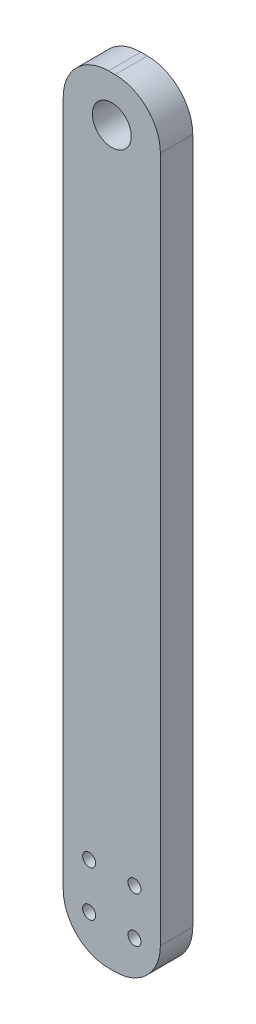
ISO-10303-21;
HEADER;
FILE_DESCRIPTION(('STEP AP214'),'2;1');
FILE_NAME('part.step','',(''),(''),'','','');
FILE_SCHEMA(('AUTOMOTIVE_DESIGN { 1 0 10303 214 1 1 1 1 }'));
ENDSEC;
DATA;
#1=APPLICATION_CONTEXT('core data for automotive mechanical design processes');
#2=APPLICATION_PROTOCOL_DEFINITION('international standard','automotive_design',2000,#1);
#3=PRODUCT_CONTEXT('',#1,'mechanical');
#4=PRODUCT('Part','Part','',(#3));
#5=PRODUCT_RELATED_PRODUCT_CATEGORY('part','',(#4));
#6=PRODUCT_DEFINITION_FORMATION('','',#4);
#7=PRODUCT_DEFINITION_CONTEXT('part definition',#1,'design');
#8=PRODUCT_DEFINITION('design','',#6,#7);
#9=PRODUCT_DEFINITION_SHAPE('','',#8);
#10=(LENGTH_UNIT() NAMED_UNIT(*) SI_UNIT(.MILLI.,.METRE.));
#11=(NAMED_UNIT(*) PLANE_ANGLE_UNIT() SI_UNIT($,.RADIAN.));
#12=(NAMED_UNIT(*) SI_UNIT($,.STERADIAN.) SOLID_ANGLE_UNIT());
#13=UNCERTAINTY_MEASURE_WITH_UNIT(LENGTH_MEASURE(1.E-05),#10,'distance_accuracy_value','');
#14=(GEOMETRIC_REPRESENTATION_CONTEXT(3) GLOBAL_UNCERTAINTY_ASSIGNED_CONTEXT((#13)) GLOBAL_UNIT_ASSIGNED_CONTEXT((#10,
#11,#12)) REPRESENTATION_CONTEXT('',''));
#15=CARTESIAN_POINT('',(0.,0.,0.));
#16=DIRECTION('',(0.,0.,1.));
#17=DIRECTION('',(1.,0.,0.));
#18=AXIS2_PLACEMENT_3D('',#15,#16,#17);
#19=CARTESIAN_POINT('',(0.,0.,5.));
#20=DIRECTION('',(0.,0.,1.));
#21=DIRECTION('',(1.,0.,0.));
#22=AXIS2_PLACEMENT_3D('',#19,#20,#21);
#23=PLANE('',#22);
#24=CARTESIAN_POINT('',(1.,8.,5.));
#25=DIRECTION('',(0.,0.,1.));
#26=DIRECTION('',(1.,0.,0.));
#27=AXIS2_PLACEMENT_3D('',#24,#25,#26);
#28=CIRCLE('',#27,1.);
#29=CARTESIAN_POINT('',(2.,8.,5.));
#30=VERTEX_POINT('',#29);
#31=EDGE_CURVE('E242',#30,#30,#28,.T.);
#32=ORIENTED_EDGE('',*,*,#31,.T.);
#33=EDGE_LOOP('',(#32));
#34=FACE_BOUND('',#33,.T.);
#35=CARTESIAN_POINT('',(7.99999999999999,1.,5.));
#36=DIRECTION('',(0.,0.,1.));
#37=DIRECTION('',(1.,0.,0.));
#38=AXIS2_PLACEMENT_3D('',#35,#36,#37);
#39=CIRCLE('',#38,1.);
#40=CARTESIAN_POINT('',(8.99999999999999,1.,5.));
#41=VERTEX_POINT('',#40);
#42=EDGE_CURVE('E228',#41,#41,#39,.T.);
#43=ORIENTED_EDGE('',*,*,#42,.T.);
#44=EDGE_LOOP('',(#43));
#45=FACE_BOUND('',#44,.T.);
#46=CARTESIAN_POINT('',(4.49999999999999,108.,5.));
#47=DIRECTION('',(0.,0.,1.));
#48=DIRECTION('',(1.,0.,0.));
#49=AXIS2_PLACEMENT_3D('',#46,#47,#48);
#50=CIRCLE('',#49,3.);
#51=CARTESIAN_POINT('',(7.5,108.,5.));
#52=VERTEX_POINT('',#51);
#53=EDGE_CURVE('E130',#52,#52,#50,.T.);
#54=ORIENTED_EDGE('',*,*,#53,.T.);
#55=EDGE_LOOP('',(#54));
#56=FACE_BOUND('',#55,.T.);
#57=CARTESIAN_POINT('',(3.99999999999999,2.,5.));
#58=DIRECTION('',(0.,0.,1.));
#59=DIRECTION('',(1.,0.,0.));
#60=AXIS2_PLACEMENT_3D('',#57,#58,#59);
#61=CIRCLE('',#60,7.);
#62=CARTESIAN_POINT('',(4.00000000000004,-5.,5.));
#63=VERTEX_POINT('',#62);
#64=CARTESIAN_POINT('',(-3.00000000000001,2.00000000000005,5.));
#65=VERTEX_POINT('',#64);
#66=EDGE_CURVE('E133',#63,#65,#61,.F.);
#67=ORIENTED_EDGE('',*,*,#66,.T.);
#68=DIRECTION('',(0.,1.,0.));
#69=VECTOR('',#68,1.);
#70=CARTESIAN_POINT('',(-3.00000000000001,0.,5.));
#71=LINE('',#70,#69);
#72=CARTESIAN_POINT('',(-3.00000000000001,108.,5.));
#73=VERTEX_POINT('',#72);
#74=EDGE_CURVE('E151',#65,#73,#71,.T.);
#75=ORIENTED_EDGE('',*,*,#74,.T.);
#76=CARTESIAN_POINT('',(3.99999999999999,108.,5.));
#77=DIRECTION('',(0.,0.,1.));
#78=DIRECTION('',(1.,0.,0.));
#79=AXIS2_PLACEMENT_3D('',#76,#77,#78);
#80=CIRCLE('',#79,7.);
#81=CARTESIAN_POINT('',(3.99999999999999,115.,5.));
#82=VERTEX_POINT('',#81);
#83=EDGE_CURVE('E149',#82,#73,#80,.T.);
#84=ORIENTED_EDGE('',*,*,#83,.F.);
#85=DIRECTION('',(1.,0.,0.));
#86=VECTOR('',#85,1.);
#87=CARTESIAN_POINT('',(0.,115.,5.));
#88=LINE('',#87,#86);
#89=CARTESIAN_POINT('',(4.99999999999999,115.,5.));
#90=VERTEX_POINT('',#89);
#91=EDGE_CURVE('E108',#82,#90,#88,.T.);
#92=ORIENTED_EDGE('',*,*,#91,.T.);
#93=CARTESIAN_POINT('',(4.99999999999999,108.,5.));
#94=DIRECTION('',(0.,0.,1.));
#95=DIRECTION('',(1.,0.,0.));
#96=AXIS2_PLACEMENT_3D('',#93,#94,#95);
#97=CIRCLE('',#96,7.);
#98=CARTESIAN_POINT('',(12.,108.,5.));
#99=VERTEX_POINT('',#98);
#100=EDGE_CURVE('E145',#90,#99,#97,.F.);
#101=ORIENTED_EDGE('',*,*,#100,.T.);
#102=DIRECTION('',(0.,1.,0.));
#103=VECTOR('',#102,1.);
#104=CARTESIAN_POINT('',(12.,0.,5.));
#105=LINE('',#104,#103);
#106=CARTESIAN_POINT('',(12.,2.00000000000005,5.));
#107=VERTEX_POINT('',#106);
#108=EDGE_CURVE('E142',#107,#99,#105,.T.);
#109=ORIENTED_EDGE('',*,*,#108,.F.);
#110=CARTESIAN_POINT('',(4.99999999999999,2.,5.));
#111=DIRECTION('',(0.,0.,1.));
#112=DIRECTION('',(1.,0.,0.));
#113=AXIS2_PLACEMENT_3D('',#110,#111,#112);
#114=CIRCLE('',#113,7.);
#115=CARTESIAN_POINT('',(4.99999999999994,-5.,5.));
#116=VERTEX_POINT('',#115);
#117=EDGE_CURVE('E139',#116,#107,#114,.T.);
#118=ORIENTED_EDGE('',*,*,#117,.F.);
#119=DIRECTION('',(1.,0.,0.));
#120=VECTOR('',#119,1.);
#121=CARTESIAN_POINT('',(0.,-5.,5.));
#122=LINE('',#121,#120);
#123=EDGE_CURVE('E136',#63,#116,#122,.T.);
#124=ORIENTED_EDGE('',*,*,#123,.F.);
#125=EDGE_LOOP('',(#67,#75,#84,#92,#101,#109,#118,#124));
#126=FACE_BOUND('',#125,.T.);
#127=CARTESIAN_POINT('',(7.99999999999999,8.,5.));
#128=DIRECTION('',(0.,0.,1.));
#129=DIRECTION('',(1.,0.,0.));
#130=AXIS2_PLACEMENT_3D('',#127,#128,#129);
#131=CIRCLE('',#130,1.);
#132=CARTESIAN_POINT('',(9.,8.,5.));
#133=VERTEX_POINT('',#132);
#134=EDGE_CURVE('E134',#133,#133,#131,.T.);
#135=ORIENTED_EDGE('',*,*,#134,.T.);
#136=EDGE_LOOP('',(#135));
#137=FACE_BOUND('',#136,.T.);
#138=CARTESIAN_POINT('',(1.,1.,5.));
#139=DIRECTION('',(0.,0.,1.));
#140=DIRECTION('',(1.,0.,0.));
#141=AXIS2_PLACEMENT_3D('',#138,#139,#140);
#142=CIRCLE('',#141,1.);
#143=CARTESIAN_POINT('',(2.,1.,5.));
#144=VERTEX_POINT('',#143);
#145=EDGE_CURVE('E233',#144,#144,#142,.T.);
#146=ORIENTED_EDGE('',*,*,#145,.T.);
#147=EDGE_LOOP('',(#146));
#148=FACE_BOUND('',#147,.T.);
#149=ADVANCED_FACE('F34',(#34,#45,#56,#126,#137,#148),#23,.F.);
#150=CARTESIAN_POINT('',(3.99999999999999,2.,10.));
#151=DIRECTION('',(0.,0.,-1.));
#152=DIRECTION('',(-1.,0.,0.));
#153=AXIS2_PLACEMENT_3D('',#150,#151,#152);
#154=CYLINDRICAL_SURFACE('',#153,7.);
#155=ORIENTED_EDGE('',*,*,#66,.F.);
#156=DIRECTION('',(0.,0.,-1.));
#157=VECTOR('',#156,1.);
#158=CARTESIAN_POINT('',(4.00000000000004,-5.,10.));
#159=LINE('',#158,#157);
#160=CARTESIAN_POINT('',(4.00000000000004,-5.,10.));
#161=VERTEX_POINT('',#160);
#162=EDGE_CURVE('E11',#161,#63,#159,.T.);
#163=ORIENTED_EDGE('',*,*,#162,.F.);
#164=CARTESIAN_POINT('',(3.99999999999999,2.,10.));
#165=DIRECTION('',(0.,0.,1.));
#166=DIRECTION('',(1.,0.,0.));
#167=AXIS2_PLACEMENT_3D('',#164,#165,#166);
#168=CIRCLE('',#167,7.);
#169=CARTESIAN_POINT('',(-3.00000000000001,2.00000000000005,10.));
#170=VERTEX_POINT('',#169);
#171=EDGE_CURVE('E252',#161,#170,#168,.F.);
#172=ORIENTED_EDGE('',*,*,#171,.T.);
#173=DIRECTION('',(0.,0.,-1.));
#174=VECTOR('',#173,1.);
#175=CARTESIAN_POINT('',(-3.00000000000001,2.00000000000005,10.));
#176=LINE('',#175,#174);
#177=EDGE_CURVE('E51',#170,#65,#176,.T.);
#178=ORIENTED_EDGE('',*,*,#177,.T.);
#179=EDGE_LOOP('',(#155,#163,#172,#178));
#180=FACE_BOUND('',#179,.T.);
#181=ADVANCED_FACE('F175',(#180),#154,.T.);
#182=CARTESIAN_POINT('',(0.,-5.,10.));
#183=DIRECTION('',(0.,1.,0.));
#184=DIRECTION('',(0.,0.,1.));
#185=AXIS2_PLACEMENT_3D('',#182,#183,#184);
#186=PLANE('',#185);
#187=ORIENTED_EDGE('',*,*,#123,.T.);
#188=DIRECTION('',(0.,0.,-1.));
#189=VECTOR('',#188,1.);
#190=CARTESIAN_POINT('',(4.99999999999994,-5.,10.));
#191=LINE('',#190,#189);
#192=CARTESIAN_POINT('',(4.99999999999994,-5.,10.));
#193=VERTEX_POINT('',#192);
#194=EDGE_CURVE('E43',#193,#116,#191,.T.);
#195=ORIENTED_EDGE('',*,*,#194,.F.);
#196=DIRECTION('',(1.,0.,0.));
#197=VECTOR('',#196,1.);
#198=CARTESIAN_POINT('',(0.,-5.,10.));
#199=LINE('',#198,#197);
#200=EDGE_CURVE('E254',#161,#193,#199,.T.);
#201=ORIENTED_EDGE('',*,*,#200,.F.);
#202=ORIENTED_EDGE('',*,*,#162,.T.);
#203=EDGE_LOOP('',(#187,#195,#201,#202));
#204=FACE_BOUND('',#203,.T.);
#205=ADVANCED_FACE('F172',(#204),#186,.F.);
#206=CARTESIAN_POINT('',(4.99999999999999,2.,10.));
#207=DIRECTION('',(0.,0.,-1.));
#208=DIRECTION('',(-1.,0.,0.));
#209=AXIS2_PLACEMENT_3D('',#206,#207,#208);
#210=CYLINDRICAL_SURFACE('',#209,7.);
#211=ORIENTED_EDGE('',*,*,#117,.T.);
#212=DIRECTION('',(0.,0.,-1.));
#213=VECTOR('',#212,1.);
#214=CARTESIAN_POINT('',(12.,2.00000000000005,10.));
#215=LINE('',#214,#213);
#216=CARTESIAN_POINT('',(12.,2.00000000000005,10.));
#217=VERTEX_POINT('',#216);
#218=EDGE_CURVE('E160',#217,#107,#215,.T.);
#219=ORIENTED_EDGE('',*,*,#218,.F.);
#220=CARTESIAN_POINT('',(4.99999999999999,2.,10.));
#221=DIRECTION('',(0.,0.,1.));
#222=DIRECTION('',(1.,0.,0.));
#223=AXIS2_PLACEMENT_3D('',#220,#221,#222);
#224=CIRCLE('',#223,7.);
#225=EDGE_CURVE('E168',#193,#217,#224,.T.);
#226=ORIENTED_EDGE('',*,*,#225,.F.);
#227=ORIENTED_EDGE('',*,*,#194,.T.);
#228=EDGE_LOOP('',(#211,#219,#226,#227));
#229=FACE_BOUND('',#228,.T.);
#230=ADVANCED_FACE('F165',(#229),#210,.T.);
#231=CARTESIAN_POINT('',(12.,0.,10.));
#232=DIRECTION('',(-1.,0.,0.));
#233=DIRECTION('',(0.,0.,1.));
#234=AXIS2_PLACEMENT_3D('',#231,#232,#233);
#235=PLANE('',#234);
#236=ORIENTED_EDGE('',*,*,#108,.T.);
#237=DIRECTION('',(0.,0.,-1.));
#238=VECTOR('',#237,1.);
#239=CARTESIAN_POINT('',(12.,108.,10.));
#240=LINE('',#239,#238);
#241=CARTESIAN_POINT('',(12.,108.,10.));
#242=VERTEX_POINT('',#241);
#243=EDGE_CURVE('E158',#242,#99,#240,.T.);
#244=ORIENTED_EDGE('',*,*,#243,.F.);
#245=DIRECTION('',(0.,1.,0.));
#246=VECTOR('',#245,1.);
#247=CARTESIAN_POINT('',(12.,0.,10.));
#248=LINE('',#247,#246);
#249=EDGE_CURVE('E125',#217,#242,#248,.T.);
#250=ORIENTED_EDGE('',*,*,#249,.F.);
#251=ORIENTED_EDGE('',*,*,#218,.T.);
#252=EDGE_LOOP('',(#236,#244,#250,#251));
#253=FACE_BOUND('',#252,.T.);
#254=ADVANCED_FACE('F187',(#253),#235,.F.);
#255=CARTESIAN_POINT('',(4.99999999999999,108.,10.));
#256=DIRECTION('',(0.,0.,-1.));
#257=DIRECTION('',(-1.,0.,0.));
#258=AXIS2_PLACEMENT_3D('',#255,#256,#257);
#259=CYLINDRICAL_SURFACE('',#258,7.);
#260=ORIENTED_EDGE('',*,*,#100,.F.);
#261=DIRECTION('',(0.,0.,-1.));
#262=VECTOR('',#261,1.);
#263=CARTESIAN_POINT('',(4.99999999999999,115.,10.));
#264=LINE('',#263,#262);
#265=CARTESIAN_POINT('',(4.99999999999999,115.,10.));
#266=VERTEX_POINT('',#265);
#267=EDGE_CURVE('E111',#266,#90,#264,.T.);
#268=ORIENTED_EDGE('',*,*,#267,.F.);
#269=CARTESIAN_POINT('',(4.99999999999999,108.,10.));
#270=DIRECTION('',(0.,0.,1.));
#271=DIRECTION('',(1.,0.,0.));
#272=AXIS2_PLACEMENT_3D('',#269,#270,#271);
#273=CIRCLE('',#272,7.);
#274=EDGE_CURVE('E123',#266,#242,#273,.F.);
#275=ORIENTED_EDGE('',*,*,#274,.T.);
#276=ORIENTED_EDGE('',*,*,#243,.T.);
#277=EDGE_LOOP('',(#260,#268,#275,#276));
#278=FACE_BOUND('',#277,.T.);
#279=ADVANCED_FACE('F190',(#278),#259,.T.);
#280=CARTESIAN_POINT('',(0.,115.,10.));
#281=DIRECTION('',(0.,1.,0.));
#282=DIRECTION('',(0.,0.,1.));
#283=AXIS2_PLACEMENT_3D('',#280,#281,#282);
#284=PLANE('',#283);
#285=ORIENTED_EDGE('',*,*,#91,.F.);
#286=DIRECTION('',(0.,0.,-1.));
#287=VECTOR('',#286,1.);
#288=CARTESIAN_POINT('',(3.99999999999999,115.,10.));
#289=LINE('',#288,#287);
#290=CARTESIAN_POINT('',(3.99999999999999,115.,10.));
#291=VERTEX_POINT('',#290);
#292=EDGE_CURVE('E102',#291,#82,#289,.T.);
#293=ORIENTED_EDGE('',*,*,#292,.F.);
#294=DIRECTION('',(1.,0.,0.));
#295=VECTOR('',#294,1.);
#296=CARTESIAN_POINT('',(0.,115.,10.));
#297=LINE('',#296,#295);
#298=EDGE_CURVE('E106',#291,#266,#297,.T.);
#299=ORIENTED_EDGE('',*,*,#298,.T.);
#300=ORIENTED_EDGE('',*,*,#267,.T.);
#301=EDGE_LOOP('',(#285,#293,#299,#300));
#302=FACE_BOUND('',#301,.T.);
#303=ADVANCED_FACE('F104',(#302),#284,.T.);
#304=CARTESIAN_POINT('',(3.99999999999999,108.,10.));
#305=DIRECTION('',(0.,0.,-1.));
#306=DIRECTION('',(-1.,0.,0.));
#307=AXIS2_PLACEMENT_3D('',#304,#305,#306);
#308=CYLINDRICAL_SURFACE('',#307,7.);
#309=ORIENTED_EDGE('',*,*,#83,.T.);
#310=DIRECTION('',(0.,0.,-1.));
#311=VECTOR('',#310,1.);
#312=CARTESIAN_POINT('',(-3.00000000000001,108.,10.));
#313=LINE('',#312,#311);
#314=CARTESIAN_POINT('',(-3.00000000000001,108.,10.));
#315=VERTEX_POINT('',#314);
#316=EDGE_CURVE('E77',#315,#73,#313,.T.);
#317=ORIENTED_EDGE('',*,*,#316,.F.);
#318=CARTESIAN_POINT('',(3.99999999999999,108.,10.));
#319=DIRECTION('',(0.,0.,1.));
#320=DIRECTION('',(1.,0.,0.));
#321=AXIS2_PLACEMENT_3D('',#318,#319,#320);
#322=CIRCLE('',#321,7.);
#323=EDGE_CURVE('E113',#291,#315,#322,.T.);
#324=ORIENTED_EDGE('',*,*,#323,.F.);
#325=ORIENTED_EDGE('',*,*,#292,.T.);
#326=EDGE_LOOP('',(#309,#317,#324,#325));
#327=FACE_BOUND('',#326,.T.);
#328=ADVANCED_FACE('F114',(#327),#308,.T.);
#329=CARTESIAN_POINT('',(4.49999999999999,108.,10.));
#330=DIRECTION('',(0.,0.,-1.));
#331=DIRECTION('',(-1.,0.,0.));
#332=AXIS2_PLACEMENT_3D('',#329,#330,#331);
#333=CYLINDRICAL_SURFACE('',#332,3.);
#334=CARTESIAN_POINT('',(4.49999999999999,108.,10.));
#335=DIRECTION('',(0.,0.,1.));
#336=DIRECTION('',(1.,0.,0.));
#337=AXIS2_PLACEMENT_3D('',#334,#335,#336);
#338=CIRCLE('',#337,3.);
#339=CARTESIAN_POINT('',(7.5,108.,10.));
#340=VERTEX_POINT('',#339);
#341=EDGE_CURVE('E154',#340,#340,#338,.T.);
#342=ORIENTED_EDGE('',*,*,#341,.T.);
#343=EDGE_LOOP('',(#342));
#344=FACE_BOUND('',#343,.T.);
#345=ORIENTED_EDGE('',*,*,#53,.F.);
#346=EDGE_LOOP('',(#345));
#347=FACE_BOUND('',#346,.T.);
#348=ADVANCED_FACE('F36',(#344,#347),#333,.F.);
#349=CARTESIAN_POINT('',(-3.00000000000001,0.,10.));
#350=DIRECTION('',(-1.,0.,0.));
#351=DIRECTION('',(0.,0.,1.));
#352=AXIS2_PLACEMENT_3D('',#349,#350,#351);
#353=PLANE('',#352);
#354=ORIENTED_EDGE('',*,*,#74,.F.);
#355=ORIENTED_EDGE('',*,*,#177,.F.);
#356=DIRECTION('',(0.,1.,0.));
#357=VECTOR('',#356,1.);
#358=CARTESIAN_POINT('',(-3.00000000000001,0.,10.));
#359=LINE('',#358,#357);
#360=EDGE_CURVE('E117',#170,#315,#359,.T.);
#361=ORIENTED_EDGE('',*,*,#360,.T.);
#362=ORIENTED_EDGE('',*,*,#316,.T.);
#363=EDGE_LOOP('',(#354,#355,#361,#362));
#364=FACE_BOUND('',#363,.T.);
#365=ADVANCED_FACE('F199',(#364),#353,.T.);
#366=CARTESIAN_POINT('',(0.,0.,10.));
#367=DIRECTION('',(0.,0.,1.));
#368=DIRECTION('',(1.,0.,0.));
#369=AXIS2_PLACEMENT_3D('',#366,#367,#368);
#370=PLANE('',#369);
#371=CARTESIAN_POINT('',(7.99999999999999,1.,10.));
#372=DIRECTION('',(0.,0.,-1.));
#373=DIRECTION('',(-1.,0.,0.));
#374=AXIS2_PLACEMENT_3D('',#371,#372,#373);
#375=CIRCLE('',#374,1.);
#376=CARTESIAN_POINT('',(6.99999999999999,1.,10.));
#377=VERTEX_POINT('',#376);
#378=EDGE_CURVE('E225',#377,#377,#375,.T.);
#379=ORIENTED_EDGE('',*,*,#378,.T.);
#380=EDGE_LOOP('',(#379));
#381=FACE_BOUND('',#380,.T.);
#382=CARTESIAN_POINT('',(1.,1.,10.));
#383=DIRECTION('',(0.,0.,-1.));
#384=DIRECTION('',(-1.,0.,0.));
#385=AXIS2_PLACEMENT_3D('',#382,#383,#384);
#386=CIRCLE('',#385,1.);
#387=CARTESIAN_POINT('',(0.,1.,10.));
#388=VERTEX_POINT('',#387);
#389=EDGE_CURVE('E230',#388,#388,#386,.T.);
#390=ORIENTED_EDGE('',*,*,#389,.T.);
#391=EDGE_LOOP('',(#390));
#392=FACE_BOUND('',#391,.T.);
#393=CARTESIAN_POINT('',(1.,8.,10.));
#394=DIRECTION('',(0.,0.,-1.));
#395=DIRECTION('',(-1.,0.,0.));
#396=AXIS2_PLACEMENT_3D('',#393,#394,#395);
#397=CIRCLE('',#396,1.);
#398=CARTESIAN_POINT('',(0.,8.,10.));
#399=VERTEX_POINT('',#398);
#400=EDGE_CURVE('E239',#399,#399,#397,.T.);
#401=ORIENTED_EDGE('',*,*,#400,.T.);
#402=EDGE_LOOP('',(#401));
#403=FACE_BOUND('',#402,.T.);
#404=CARTESIAN_POINT('',(7.99999999999999,8.,10.));
#405=DIRECTION('',(0.,0.,-1.));
#406=DIRECTION('',(-1.,0.,0.));
#407=AXIS2_PLACEMENT_3D('',#404,#405,#406);
#408=CIRCLE('',#407,1.);
#409=CARTESIAN_POINT('',(6.99999999999999,8.,10.));
#410=VERTEX_POINT('',#409);
#411=EDGE_CURVE('E245',#410,#410,#408,.T.);
#412=ORIENTED_EDGE('',*,*,#411,.T.);
#413=EDGE_LOOP('',(#412));
#414=FACE_BOUND('',#413,.T.);
#415=ORIENTED_EDGE('',*,*,#341,.F.);
#416=EDGE_LOOP('',(#415));
#417=FACE_BOUND('',#416,.T.);
#418=ORIENTED_EDGE('',*,*,#171,.F.);
#419=ORIENTED_EDGE('',*,*,#200,.T.);
#420=ORIENTED_EDGE('',*,*,#225,.T.);
#421=ORIENTED_EDGE('',*,*,#249,.T.);
#422=ORIENTED_EDGE('',*,*,#274,.F.);
#423=ORIENTED_EDGE('',*,*,#298,.F.);
#424=ORIENTED_EDGE('',*,*,#323,.T.);
#425=ORIENTED_EDGE('',*,*,#360,.F.);
#426=EDGE_LOOP('',(#418,#419,#420,#421,#422,#423,#424,#425));
#427=FACE_BOUND('',#426,.T.);
#428=ADVANCED_FACE('F121',(#381,#392,#403,#414,#417,#427),#370,.T.);
#429=CARTESIAN_POINT('',(7.99999999999999,8.,10.));
#430=DIRECTION('',(0.,0.,-1.));
#431=DIRECTION('',(-1.,0.,0.));
#432=AXIS2_PLACEMENT_3D('',#429,#430,#431);
#433=CYLINDRICAL_SURFACE('',#432,1.);
#434=ORIENTED_EDGE('',*,*,#411,.F.);
#435=EDGE_LOOP('',(#434));
#436=FACE_BOUND('',#435,.T.);
#437=ORIENTED_EDGE('',*,*,#134,.F.);
#438=EDGE_LOOP('',(#437));
#439=FACE_BOUND('',#438,.T.);
#440=ADVANCED_FACE('F204',(#436,#439),#433,.F.);
#441=CARTESIAN_POINT('',(1.,8.,10.));
#442=DIRECTION('',(0.,0.,-1.));
#443=DIRECTION('',(-1.,0.,0.));
#444=AXIS2_PLACEMENT_3D('',#441,#442,#443);
#445=CYLINDRICAL_SURFACE('',#444,1.);
#446=ORIENTED_EDGE('',*,*,#400,.F.);
#447=EDGE_LOOP('',(#446));
#448=FACE_BOUND('',#447,.T.);
#449=ORIENTED_EDGE('',*,*,#31,.F.);
#450=EDGE_LOOP('',(#449));
#451=FACE_BOUND('',#450,.T.);
#452=ADVANCED_FACE('F208',(#448,#451),#445,.F.);
#453=CARTESIAN_POINT('',(1.,1.,10.));
#454=DIRECTION('',(0.,0.,-1.));
#455=DIRECTION('',(-1.,0.,0.));
#456=AXIS2_PLACEMENT_3D('',#453,#454,#455);
#457=CYLINDRICAL_SURFACE('',#456,1.);
#458=ORIENTED_EDGE('',*,*,#389,.F.);
#459=EDGE_LOOP('',(#458));
#460=FACE_BOUND('',#459,.T.);
#461=ORIENTED_EDGE('',*,*,#145,.F.);
#462=EDGE_LOOP('',(#461));
#463=FACE_BOUND('',#462,.T.);
#464=ADVANCED_FACE('F212',(#460,#463),#457,.F.);
#465=CARTESIAN_POINT('',(7.99999999999999,1.,10.));
#466=DIRECTION('',(0.,0.,-1.));
#467=DIRECTION('',(-1.,0.,0.));
#468=AXIS2_PLACEMENT_3D('',#465,#466,#467);
#469=CYLINDRICAL_SURFACE('',#468,1.);
#470=ORIENTED_EDGE('',*,*,#378,.F.);
#471=EDGE_LOOP('',(#470));
#472=FACE_BOUND('',#471,.T.);
#473=ORIENTED_EDGE('',*,*,#42,.F.);
#474=EDGE_LOOP('',(#473));
#475=FACE_BOUND('',#474,.T.);
#476=ADVANCED_FACE('F216',(#472,#475),#469,.F.);
#477=CLOSED_SHELL('',(#149,#181,#205,#230,#254,#279,#303,#328,#348,#365,#428,#440,#452,#464,#476));
#478=MANIFOLD_SOLID_BREP('B2',#477);
#479=ADVANCED_BREP_SHAPE_REPRESENTATION('',(#18,#478),#14);
#480=SHAPE_DEFINITION_REPRESENTATION(#9,#479);
ENDSEC;
END-ISO-10303-21;
